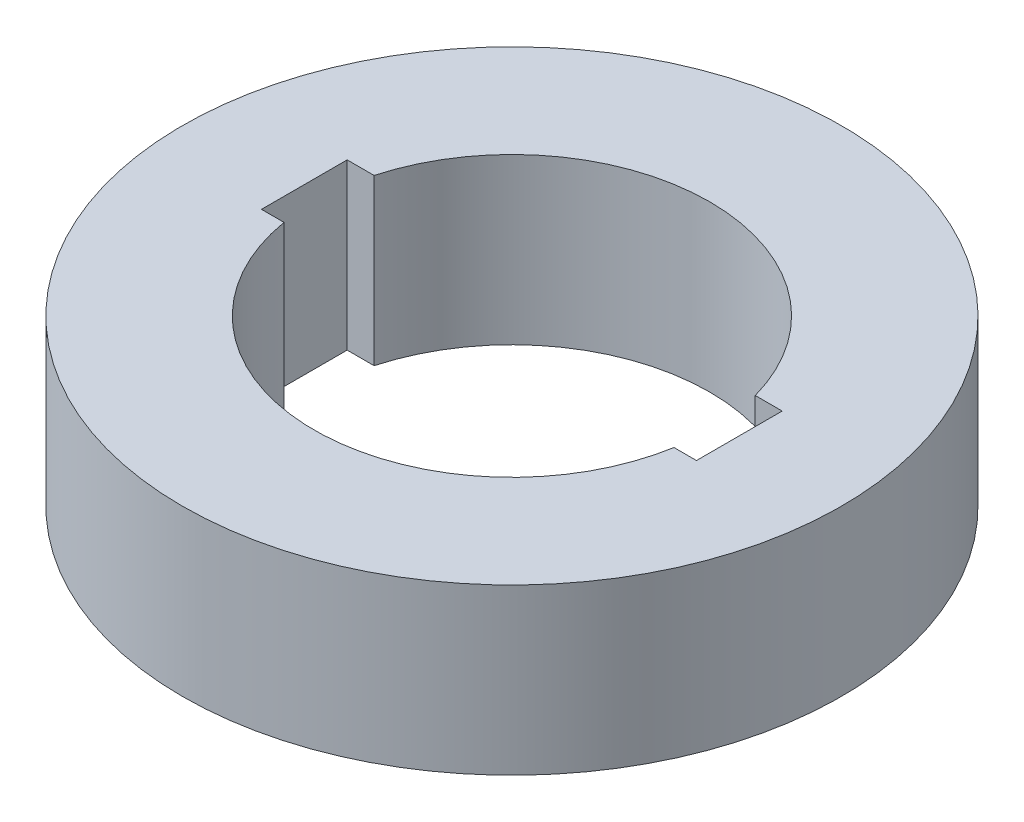
ISO-10303-21;
HEADER;
FILE_DESCRIPTION(('STEP AP214'),'2;1');
FILE_NAME('part.step','',(''),(''),'','','');
FILE_SCHEMA(('AUTOMOTIVE_DESIGN { 1 0 10303 214 1 1 1 1 }'));
ENDSEC;
DATA;
#1=APPLICATION_CONTEXT('core data for automotive mechanical design processes');
#2=APPLICATION_PROTOCOL_DEFINITION('international standard','automotive_design',2000,#1);
#3=PRODUCT_CONTEXT('',#1,'mechanical');
#4=PRODUCT('Part','Part','',(#3));
#5=PRODUCT_RELATED_PRODUCT_CATEGORY('part','',(#4));
#6=PRODUCT_DEFINITION_FORMATION('','',#4);
#7=PRODUCT_DEFINITION_CONTEXT('part definition',#1,'design');
#8=PRODUCT_DEFINITION('design','',#6,#7);
#9=PRODUCT_DEFINITION_SHAPE('','',#8);
#10=(LENGTH_UNIT() NAMED_UNIT(*) SI_UNIT(.MILLI.,.METRE.));
#11=(NAMED_UNIT(*) PLANE_ANGLE_UNIT() SI_UNIT($,.RADIAN.));
#12=(NAMED_UNIT(*) SI_UNIT($,.STERADIAN.) SOLID_ANGLE_UNIT());
#13=UNCERTAINTY_MEASURE_WITH_UNIT(LENGTH_MEASURE(1.E-05),#10,'distance_accuracy_value','');
#14=(GEOMETRIC_REPRESENTATION_CONTEXT(3) GLOBAL_UNCERTAINTY_ASSIGNED_CONTEXT((#13)) GLOBAL_UNIT_ASSIGNED_CONTEXT((#10,
#11,#12)) REPRESENTATION_CONTEXT('',''));
#15=CARTESIAN_POINT('',(0.,0.,0.));
#16=DIRECTION('',(0.,0.,1.));
#17=DIRECTION('',(1.,0.,0.));
#18=AXIS2_PLACEMENT_3D('',#15,#16,#17);
#19=CARTESIAN_POINT('',(0.,25.,0.));
#20=DIRECTION('',(0.,-1.,0.));
#21=DIRECTION('',(0.,0.,-1.));
#22=AXIS2_PLACEMENT_3D('',#19,#20,#21);
#23=CYLINDRICAL_SURFACE('',#22,30.);
#24=DIRECTION('',(0.,-1.,0.));
#25=VECTOR('',#24,1.);
#26=CARTESIAN_POINT('',(28.9136645896019,25.,-8.));
#27=LINE('',#26,#25);
#28=CARTESIAN_POINT('',(28.9136645896019,25.,-8.));
#29=VERTEX_POINT('',#28);
#30=CARTESIAN_POINT('',(28.9136645896019,0.,-8.));
#31=VERTEX_POINT('',#30);
#32=EDGE_CURVE('E11',#29,#31,#27,.T.);
#33=ORIENTED_EDGE('',*,*,#32,.F.);
#34=CARTESIAN_POINT('',(0.,25.,0.));
#35=DIRECTION('',(0.,1.,0.));
#36=DIRECTION('',(0.,0.,1.));
#37=AXIS2_PLACEMENT_3D('',#34,#35,#36);
#38=CIRCLE('',#37,30.);
#39=CARTESIAN_POINT('',(-28.9136645896019,25.,-8.));
#40=VERTEX_POINT('',#39);
#41=EDGE_CURVE('E175',#29,#40,#38,.T.);
#42=ORIENTED_EDGE('',*,*,#41,.T.);
#43=DIRECTION('',(0.,-1.,0.));
#44=VECTOR('',#43,1.);
#45=CARTESIAN_POINT('',(-28.9136645896019,25.,-8.));
#46=LINE('',#45,#44);
#47=CARTESIAN_POINT('',(-28.9136645896019,0.,-8.));
#48=VERTEX_POINT('',#47);
#49=EDGE_CURVE('E56',#48,#40,#46,.F.);
#50=ORIENTED_EDGE('',*,*,#49,.F.);
#51=CARTESIAN_POINT('',(0.,0.,0.));
#52=DIRECTION('',(0.,1.,0.));
#53=DIRECTION('',(0.,0.,1.));
#54=AXIS2_PLACEMENT_3D('',#51,#52,#53);
#55=CIRCLE('',#54,30.);
#56=EDGE_CURVE('E176',#31,#48,#55,.T.);
#57=ORIENTED_EDGE('',*,*,#56,.F.);
#58=EDGE_LOOP('',(#33,#42,#50,#57));
#59=FACE_BOUND('',#58,.T.);
#60=ADVANCED_FACE('F47',(#59),#23,.F.);
#61=CARTESIAN_POINT('',(0.,25.,0.));
#62=DIRECTION('',(0.,1.,0.));
#63=DIRECTION('',(0.,0.,1.));
#64=AXIS2_PLACEMENT_3D('',#61,#62,#63);
#65=PLANE('',#64);
#66=DIRECTION('',(-1.,0.,0.));
#67=VECTOR('',#66,1.);
#68=CARTESIAN_POINT('',(-33.,25.,-8.));
#69=LINE('',#68,#67);
#70=CARTESIAN_POINT('',(-33.,25.,-8.));
#71=VERTEX_POINT('',#70);
#72=EDGE_CURVE('E143',#40,#71,#69,.T.);
#73=ORIENTED_EDGE('',*,*,#72,.F.);
#74=ORIENTED_EDGE('',*,*,#41,.F.);
#75=CARTESIAN_POINT('',(33.,25.,-8.));
#76=VERTEX_POINT('',#75);
#77=EDGE_CURVE('E139',#76,#29,#69,.T.);
#78=ORIENTED_EDGE('',*,*,#77,.F.);
#79=DIRECTION('',(0.,0.,-1.));
#80=VECTOR('',#79,1.);
#81=CARTESIAN_POINT('',(33.,25.,-8.));
#82=LINE('',#81,#80);
#83=CARTESIAN_POINT('',(33.,25.,5.));
#84=VERTEX_POINT('',#83);
#85=EDGE_CURVE('E157',#84,#76,#82,.T.);
#86=ORIENTED_EDGE('',*,*,#85,.F.);
#87=DIRECTION('',(1.,0.,0.));
#88=VECTOR('',#87,1.);
#89=CARTESIAN_POINT('',(-33.,25.,5.));
#90=LINE('',#89,#88);
#91=CARTESIAN_POINT('',(29.5803989154981,25.,5.));
#92=VERTEX_POINT('',#91);
#93=EDGE_CURVE('E154',#92,#84,#90,.T.);
#94=ORIENTED_EDGE('',*,*,#93,.F.);
#95=CARTESIAN_POINT('',(-29.5803989154981,25.,5.));
#96=VERTEX_POINT('',#95);
#97=EDGE_CURVE('E171',#96,#92,#38,.T.);
#98=ORIENTED_EDGE('',*,*,#97,.F.);
#99=CARTESIAN_POINT('',(-33.,25.,5.));
#100=VERTEX_POINT('',#99);
#101=EDGE_CURVE('E71',#100,#96,#90,.T.);
#102=ORIENTED_EDGE('',*,*,#101,.F.);
#103=DIRECTION('',(0.,0.,1.));
#104=VECTOR('',#103,1.);
#105=CARTESIAN_POINT('',(-33.,25.,-8.));
#106=LINE('',#105,#104);
#107=EDGE_CURVE('E120',#71,#100,#106,.T.);
#108=ORIENTED_EDGE('',*,*,#107,.F.);
#109=EDGE_LOOP('',(#73,#74,#78,#86,#94,#98,#102,#108));
#110=FACE_BOUND('',#109,.T.);
#111=CARTESIAN_POINT('',(0.,25.,0.));
#112=DIRECTION('',(0.,1.,0.));
#113=DIRECTION('',(0.,0.,1.));
#114=AXIS2_PLACEMENT_3D('',#111,#112,#113);
#115=CIRCLE('',#114,50.);
#116=CARTESIAN_POINT('',(0.,25.,50.));
#117=VERTEX_POINT('',#116);
#118=EDGE_CURVE('E179',#117,#117,#115,.T.);
#119=ORIENTED_EDGE('',*,*,#118,.T.);
#120=EDGE_LOOP('',(#119));
#121=FACE_BOUND('',#120,.T.);
#122=ADVANCED_FACE('F201',(#110,#121),#65,.T.);
#123=CARTESIAN_POINT('',(0.,0.,0.));
#124=DIRECTION('',(0.,1.,0.));
#125=DIRECTION('',(0.,0.,1.));
#126=AXIS2_PLACEMENT_3D('',#123,#124,#125);
#127=PLANE('',#126);
#128=CARTESIAN_POINT('',(0.,0.,0.));
#129=DIRECTION('',(0.,1.,0.));
#130=DIRECTION('',(0.,0.,1.));
#131=AXIS2_PLACEMENT_3D('',#128,#129,#130);
#132=CIRCLE('',#131,50.);
#133=CARTESIAN_POINT('',(0.,0.,50.));
#134=VERTEX_POINT('',#133);
#135=EDGE_CURVE('E184',#134,#134,#132,.T.);
#136=ORIENTED_EDGE('',*,*,#135,.F.);
#137=EDGE_LOOP('',(#136));
#138=FACE_BOUND('',#137,.T.);
#139=ORIENTED_EDGE('',*,*,#56,.T.);
#140=DIRECTION('',(-1.,0.,0.));
#141=VECTOR('',#140,1.);
#142=CARTESIAN_POINT('',(-33.,0.,-8.));
#143=LINE('',#142,#141);
#144=CARTESIAN_POINT('',(-33.,0.,-8.));
#145=VERTEX_POINT('',#144);
#146=EDGE_CURVE('E137',#48,#145,#143,.T.);
#147=ORIENTED_EDGE('',*,*,#146,.T.);
#148=DIRECTION('',(0.,0.,1.));
#149=VECTOR('',#148,1.);
#150=CARTESIAN_POINT('',(-33.,0.,-8.));
#151=LINE('',#150,#149);
#152=CARTESIAN_POINT('',(-33.,0.,5.));
#153=VERTEX_POINT('',#152);
#154=EDGE_CURVE('E117',#145,#153,#151,.T.);
#155=ORIENTED_EDGE('',*,*,#154,.T.);
#156=DIRECTION('',(1.,0.,0.));
#157=VECTOR('',#156,1.);
#158=CARTESIAN_POINT('',(-33.,0.,5.));
#159=LINE('',#158,#157);
#160=CARTESIAN_POINT('',(-29.5803989154981,0.,5.));
#161=VERTEX_POINT('',#160);
#162=EDGE_CURVE('E126',#153,#161,#159,.T.);
#163=ORIENTED_EDGE('',*,*,#162,.T.);
#164=CARTESIAN_POINT('',(29.5803989154981,0.,5.));
#165=VERTEX_POINT('',#164);
#166=EDGE_CURVE('E164',#161,#165,#55,.T.);
#167=ORIENTED_EDGE('',*,*,#166,.T.);
#168=CARTESIAN_POINT('',(33.,0.,5.));
#169=VERTEX_POINT('',#168);
#170=EDGE_CURVE('E63',#165,#169,#159,.T.);
#171=ORIENTED_EDGE('',*,*,#170,.T.);
#172=DIRECTION('',(0.,0.,-1.));
#173=VECTOR('',#172,1.);
#174=CARTESIAN_POINT('',(33.,0.,-8.));
#175=LINE('',#174,#173);
#176=CARTESIAN_POINT('',(33.,0.,-8.));
#177=VERTEX_POINT('',#176);
#178=EDGE_CURVE('E133',#169,#177,#175,.T.);
#179=ORIENTED_EDGE('',*,*,#178,.T.);
#180=EDGE_CURVE('E123',#177,#31,#143,.T.);
#181=ORIENTED_EDGE('',*,*,#180,.T.);
#182=EDGE_LOOP('',(#139,#147,#155,#163,#167,#171,#179,#181));
#183=FACE_BOUND('',#182,.T.);
#184=ADVANCED_FACE('F136',(#138,#183),#127,.F.);
#185=CARTESIAN_POINT('',(0.,25.,0.));
#186=DIRECTION('',(0.,-1.,0.));
#187=DIRECTION('',(0.,0.,-1.));
#188=AXIS2_PLACEMENT_3D('',#185,#186,#187);
#189=CYLINDRICAL_SURFACE('',#188,50.);
#190=ORIENTED_EDGE('',*,*,#118,.F.);
#191=EDGE_LOOP('',(#190));
#192=FACE_BOUND('',#191,.T.);
#193=ORIENTED_EDGE('',*,*,#135,.T.);
#194=EDGE_LOOP('',(#193));
#195=FACE_BOUND('',#194,.T.);
#196=ADVANCED_FACE('F49',(#192,#195),#189,.T.);
#197=DIRECTION('',(0.,-1.,0.));
#198=VECTOR('',#197,1.);
#199=CARTESIAN_POINT('',(-29.5803989154981,25.,5.));
#200=LINE('',#199,#198);
#201=EDGE_CURVE('E128',#96,#161,#200,.T.);
#202=ORIENTED_EDGE('',*,*,#201,.F.);
#203=ORIENTED_EDGE('',*,*,#97,.T.);
#204=DIRECTION('',(0.,-1.,0.));
#205=VECTOR('',#204,1.);
#206=CARTESIAN_POINT('',(29.5803989154981,25.,5.));
#207=LINE('',#206,#205);
#208=EDGE_CURVE('E183',#165,#92,#207,.F.);
#209=ORIENTED_EDGE('',*,*,#208,.F.);
#210=ORIENTED_EDGE('',*,*,#166,.F.);
#211=EDGE_LOOP('',(#202,#203,#209,#210));
#212=FACE_BOUND('',#211,.T.);
#213=ADVANCED_FACE('F221',(#212),#23,.F.);
#214=CARTESIAN_POINT('',(-33.,0.,-8.));
#215=DIRECTION('',(0.,0.,-1.));
#216=DIRECTION('',(-1.,0.,0.));
#217=AXIS2_PLACEMENT_3D('',#214,#215,#216);
#218=PLANE('',#217);
#219=ORIENTED_EDGE('',*,*,#32,.T.);
#220=ORIENTED_EDGE('',*,*,#180,.F.);
#221=DIRECTION('',(0.,1.,0.));
#222=VECTOR('',#221,1.);
#223=CARTESIAN_POINT('',(33.,0.,-8.));
#224=LINE('',#223,#222);
#225=EDGE_CURVE('E165',#177,#76,#224,.T.);
#226=ORIENTED_EDGE('',*,*,#225,.T.);
#227=ORIENTED_EDGE('',*,*,#77,.T.);
#228=EDGE_LOOP('',(#219,#220,#226,#227));
#229=FACE_BOUND('',#228,.T.);
#230=ADVANCED_FACE('F212',(#229),#218,.F.);
#231=CARTESIAN_POINT('',(-33.,0.,5.));
#232=DIRECTION('',(0.,0.,1.));
#233=DIRECTION('',(1.,0.,0.));
#234=AXIS2_PLACEMENT_3D('',#231,#232,#233);
#235=PLANE('',#234);
#236=ORIENTED_EDGE('',*,*,#208,.T.);
#237=ORIENTED_EDGE('',*,*,#93,.T.);
#238=DIRECTION('',(0.,1.,0.));
#239=VECTOR('',#238,1.);
#240=CARTESIAN_POINT('',(33.,0.,5.));
#241=LINE('',#240,#239);
#242=EDGE_CURVE('E122',#169,#84,#241,.T.);
#243=ORIENTED_EDGE('',*,*,#242,.F.);
#244=ORIENTED_EDGE('',*,*,#170,.F.);
#245=EDGE_LOOP('',(#236,#237,#243,#244));
#246=FACE_BOUND('',#245,.T.);
#247=ADVANCED_FACE('F218',(#246),#235,.F.);
#248=CARTESIAN_POINT('',(33.,0.,-8.));
#249=DIRECTION('',(1.,0.,0.));
#250=DIRECTION('',(0.,0.,-1.));
#251=AXIS2_PLACEMENT_3D('',#248,#249,#250);
#252=PLANE('',#251);
#253=ORIENTED_EDGE('',*,*,#85,.T.);
#254=ORIENTED_EDGE('',*,*,#225,.F.);
#255=ORIENTED_EDGE('',*,*,#178,.F.);
#256=ORIENTED_EDGE('',*,*,#242,.T.);
#257=EDGE_LOOP('',(#253,#254,#255,#256));
#258=FACE_BOUND('',#257,.T.);
#259=ADVANCED_FACE('F217',(#258),#252,.F.);
#260=ORIENTED_EDGE('',*,*,#201,.T.);
#261=ORIENTED_EDGE('',*,*,#162,.F.);
#262=DIRECTION('',(0.,1.,0.));
#263=VECTOR('',#262,1.);
#264=CARTESIAN_POINT('',(-33.,0.,5.));
#265=LINE('',#264,#263);
#266=EDGE_CURVE('E112',#153,#100,#265,.T.);
#267=ORIENTED_EDGE('',*,*,#266,.T.);
#268=ORIENTED_EDGE('',*,*,#101,.T.);
#269=EDGE_LOOP('',(#260,#261,#267,#268));
#270=FACE_BOUND('',#269,.T.);
#271=ADVANCED_FACE('F127',(#270),#235,.F.);
#272=CARTESIAN_POINT('',(-33.,0.,-8.));
#273=DIRECTION('',(-1.,0.,0.));
#274=DIRECTION('',(0.,0.,1.));
#275=AXIS2_PLACEMENT_3D('',#272,#273,#274);
#276=PLANE('',#275);
#277=ORIENTED_EDGE('',*,*,#107,.T.);
#278=ORIENTED_EDGE('',*,*,#266,.F.);
#279=ORIENTED_EDGE('',*,*,#154,.F.);
#280=DIRECTION('',(0.,1.,0.));
#281=VECTOR('',#280,1.);
#282=CARTESIAN_POINT('',(-33.,0.,-8.));
#283=LINE('',#282,#281);
#284=EDGE_CURVE('E161',#145,#71,#283,.T.);
#285=ORIENTED_EDGE('',*,*,#284,.T.);
#286=EDGE_LOOP('',(#277,#278,#279,#285));
#287=FACE_BOUND('',#286,.T.);
#288=ADVANCED_FACE('F114',(#287),#276,.F.);
#289=ORIENTED_EDGE('',*,*,#49,.T.);
#290=ORIENTED_EDGE('',*,*,#72,.T.);
#291=ORIENTED_EDGE('',*,*,#284,.F.);
#292=ORIENTED_EDGE('',*,*,#146,.F.);
#293=EDGE_LOOP('',(#289,#290,#291,#292));
#294=FACE_BOUND('',#293,.T.);
#295=ADVANCED_FACE('F195',(#294),#218,.F.);
#296=CLOSED_SHELL('',(#60,#122,#184,#196,#213,#230,#247,#259,#271,#288,#295));
#297=MANIFOLD_SOLID_BREP('B2',#296);
#298=ADVANCED_BREP_SHAPE_REPRESENTATION('',(#18,#297),#14);
#299=SHAPE_DEFINITION_REPRESENTATION(#9,#298);
ENDSEC;
END-ISO-10303-21;
